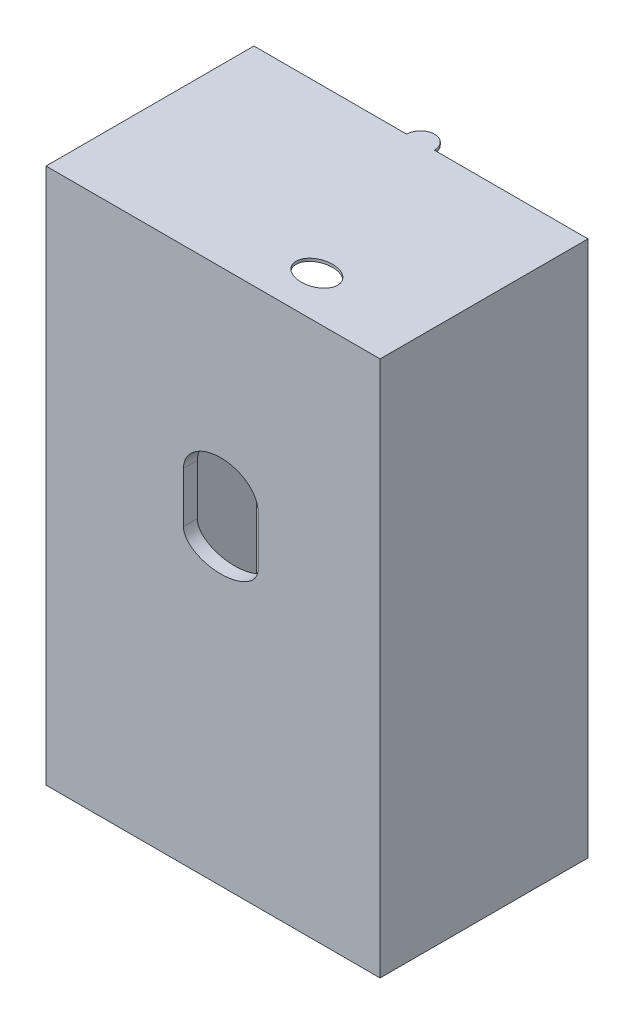
ISO-10303-21;
HEADER;
FILE_DESCRIPTION(('STEP AP214'),'2;1');
FILE_NAME('part.step','',(''),(''),'','','');
FILE_SCHEMA(('AUTOMOTIVE_DESIGN { 1 0 10303 214 1 1 1 1 }'));
ENDSEC;
DATA;
#1=APPLICATION_CONTEXT('core data for automotive mechanical design processes');
#2=APPLICATION_PROTOCOL_DEFINITION('international standard','automotive_design',2000,#1);
#3=PRODUCT_CONTEXT('',#1,'mechanical');
#4=PRODUCT('Part','Part','',(#3));
#5=PRODUCT_RELATED_PRODUCT_CATEGORY('part','',(#4));
#6=PRODUCT_DEFINITION_FORMATION('','',#4);
#7=PRODUCT_DEFINITION_CONTEXT('part definition',#1,'design');
#8=PRODUCT_DEFINITION('design','',#6,#7);
#9=PRODUCT_DEFINITION_SHAPE('','',#8);
#10=(LENGTH_UNIT() NAMED_UNIT(*) SI_UNIT(.MILLI.,.METRE.));
#11=(NAMED_UNIT(*) PLANE_ANGLE_UNIT() SI_UNIT($,.RADIAN.));
#12=(NAMED_UNIT(*) SI_UNIT($,.STERADIAN.) SOLID_ANGLE_UNIT());
#13=UNCERTAINTY_MEASURE_WITH_UNIT(LENGTH_MEASURE(1.E-05),#10,'distance_accuracy_value','');
#14=(GEOMETRIC_REPRESENTATION_CONTEXT(3) GLOBAL_UNCERTAINTY_ASSIGNED_CONTEXT((#13)) GLOBAL_UNIT_ASSIGNED_CONTEXT((#10,
#11,#12)) REPRESENTATION_CONTEXT('',''));
#15=CARTESIAN_POINT('',(0.,0.,0.));
#16=DIRECTION('',(0.,0.,1.));
#17=DIRECTION('',(1.,0.,0.));
#18=AXIS2_PLACEMENT_3D('',#15,#16,#17);
#19=CARTESIAN_POINT('',(-60.2322063663357,96.6546289170818,75.));
#20=DIRECTION('',(1.,0.,0.));
#21=DIRECTION('',(0.,1.,0.));
#22=AXIS2_PLACEMENT_3D('',#19,#20,#21);
#23=PLANE('',#22);
#24=DIRECTION('',(0.,-1.,0.));
#25=VECTOR('',#24,1.);
#26=CARTESIAN_POINT('',(-60.2322063663357,96.6546289170818,0.));
#27=LINE('',#26,#25);
#28=CARTESIAN_POINT('',(-60.2322063663357,96.6546289170818,0.));
#29=VERTEX_POINT('',#28);
#30=CARTESIAN_POINT('',(-60.2322063663357,-96.7686722464937,0.));
#31=VERTEX_POINT('',#30);
#32=EDGE_CURVE('E224',#29,#31,#27,.T.);
#33=ORIENTED_EDGE('',*,*,#32,.T.);
#34=DIRECTION('',(0.,0.,-1.));
#35=VECTOR('',#34,1.);
#36=CARTESIAN_POINT('',(-60.2322063663357,-96.7686722464937,75.));
#37=LINE('',#36,#35);
#38=CARTESIAN_POINT('',(-60.2322063663357,-96.7686722464937,75.));
#39=VERTEX_POINT('',#38);
#40=EDGE_CURVE('E220',#39,#31,#37,.T.);
#41=ORIENTED_EDGE('',*,*,#40,.F.);
#42=DIRECTION('',(0.,-1.,0.));
#43=VECTOR('',#42,1.);
#44=CARTESIAN_POINT('',(-60.2322063663357,96.6546289170818,75.));
#45=LINE('',#44,#43);
#46=CARTESIAN_POINT('',(-60.2322063663357,96.6546289170818,75.));
#47=VERTEX_POINT('',#46);
#48=EDGE_CURVE('E238',#47,#39,#45,.T.);
#49=ORIENTED_EDGE('',*,*,#48,.F.);
#50=DIRECTION('',(0.,0.,-1.));
#51=VECTOR('',#50,1.);
#52=CARTESIAN_POINT('',(-60.2322063663357,96.6546289170818,75.));
#53=LINE('',#52,#51);
#54=EDGE_CURVE('E239',#47,#29,#53,.T.);
#55=ORIENTED_EDGE('',*,*,#54,.T.);
#56=EDGE_LOOP('',(#33,#41,#49,#55));
#57=FACE_BOUND('',#56,.T.);
#58=ADVANCED_FACE('F33',(#57),#23,.F.);
#59=CARTESIAN_POINT('',(-60.2322063663357,-96.7686722464937,75.));
#60=DIRECTION('',(0.,1.,0.));
#61=DIRECTION('',(-1.,0.,0.));
#62=AXIS2_PLACEMENT_3D('',#59,#60,#61);
#63=PLANE('',#62);
#64=DIRECTION('',(1.,0.,0.));
#65=VECTOR('',#64,1.);
#66=CARTESIAN_POINT('',(-60.2322063663357,-96.7686722464937,0.));
#67=LINE('',#66,#65);
#68=CARTESIAN_POINT('',(60.2848054498777,-96.7686722464937,0.));
#69=VERTEX_POINT('',#68);
#70=EDGE_CURVE('E215',#31,#69,#67,.T.);
#71=ORIENTED_EDGE('',*,*,#70,.T.);
#72=DIRECTION('',(0.,0.,-1.));
#73=VECTOR('',#72,1.);
#74=CARTESIAN_POINT('',(60.2848054498777,-96.7686722464937,75.));
#75=LINE('',#74,#73);
#76=CARTESIAN_POINT('',(60.2848054498777,-96.7686722464937,75.));
#77=VERTEX_POINT('',#76);
#78=EDGE_CURVE('E217',#77,#69,#75,.T.);
#79=ORIENTED_EDGE('',*,*,#78,.F.);
#80=DIRECTION('',(1.,0.,0.));
#81=VECTOR('',#80,1.);
#82=CARTESIAN_POINT('',(-60.2322063663357,-96.7686722464937,75.));
#83=LINE('',#82,#81);
#84=EDGE_CURVE('E305',#39,#77,#83,.T.);
#85=ORIENTED_EDGE('',*,*,#84,.F.);
#86=ORIENTED_EDGE('',*,*,#40,.T.);
#87=EDGE_LOOP('',(#71,#79,#85,#86));
#88=FACE_BOUND('',#87,.T.);
#89=ADVANCED_FACE('F204',(#88),#63,.F.);
#90=CARTESIAN_POINT('',(60.2848054498777,96.6546289170818,75.));
#91=DIRECTION('',(1.,0.,0.));
#92=DIRECTION('',(0.,1.,0.));
#93=AXIS2_PLACEMENT_3D('',#90,#91,#92);
#94=PLANE('',#93);
#95=DIRECTION('',(0.,-1.,0.));
#96=VECTOR('',#95,1.);
#97=CARTESIAN_POINT('',(60.2848054498777,96.6546289170818,0.));
#98=LINE('',#97,#96);
#99=CARTESIAN_POINT('',(60.2848054498777,96.6546289170818,0.));
#100=VERTEX_POINT('',#99);
#101=EDGE_CURVE('E223',#100,#69,#98,.T.);
#102=ORIENTED_EDGE('',*,*,#101,.F.);
#103=DIRECTION('',(0.,0.,-1.));
#104=VECTOR('',#103,1.);
#105=CARTESIAN_POINT('',(60.2848054498777,96.6546289170818,75.));
#106=LINE('',#105,#104);
#107=CARTESIAN_POINT('',(60.2848054498777,96.6546289170818,75.));
#108=VERTEX_POINT('',#107);
#109=EDGE_CURVE('E241',#108,#100,#106,.T.);
#110=ORIENTED_EDGE('',*,*,#109,.F.);
#111=DIRECTION('',(0.,-1.,0.));
#112=VECTOR('',#111,1.);
#113=CARTESIAN_POINT('',(60.2848054498777,96.6546289170818,75.));
#114=LINE('',#113,#112);
#115=EDGE_CURVE('E307',#108,#77,#114,.T.);
#116=ORIENTED_EDGE('',*,*,#115,.T.);
#117=ORIENTED_EDGE('',*,*,#78,.T.);
#118=EDGE_LOOP('',(#102,#110,#116,#117));
#119=FACE_BOUND('',#118,.T.);
#120=ADVANCED_FACE('F201',(#119),#94,.T.);
#121=CARTESIAN_POINT('',(-60.2322063663357,96.6546289170818,75.));
#122=DIRECTION('',(0.,1.,0.));
#123=DIRECTION('',(0.,0.,1.));
#124=AXIS2_PLACEMENT_3D('',#121,#122,#123);
#125=PLANE('',#124);
#126=CARTESIAN_POINT('',(14.6071267442289,96.6546289170818,59.6252740657168));
#127=CARTESIAN_POINT('',(14.6071267442289,96.6546289170818,59.9964232358016));
#128=CARTESIAN_POINT('',(14.6557536156832,96.6546289170818,60.3606546169757));
#129=CARTESIAN_POINT('',(14.797863596421,96.6546289170818,60.8971614258045));
#130=CARTESIAN_POINT('',(14.8568495959941,96.6546289170818,61.0743445046378));
#131=CARTESIAN_POINT('',(14.9984446000285,96.6546289170818,61.4253499903886));
#132=CARTESIAN_POINT('',(15.0814846221753,96.6546289170818,61.599936569755));
#133=CARTESIAN_POINT('',(15.3646727900112,96.6546289170818,62.1130677915949));
#134=CARTESIAN_POINT('',(15.5953408905181,96.6546289170818,62.4361796315241));
#135=CARTESIAN_POINT('',(16.0021799884325,96.6546289170818,62.8932798013749));
#136=CARTESIAN_POINT('',(16.1480062684244,96.6546289170818,63.0410185045289));
#137=CARTESIAN_POINT('',(16.460654261866,96.6546289170818,63.3269820622723));
#138=CARTESIAN_POINT('',(16.6272324069616,96.6546289170818,63.4647941320253));
#139=CARTESIAN_POINT('',(17.147507806283,96.6546289170818,63.8549233786363));
#140=CARTESIAN_POINT('',(17.5248507547321,96.6546289170818,64.0873003864947));
#141=CARTESIAN_POINT('',(18.1366361103774,96.6546289170818,64.3942731667104));
#142=CARTESIAN_POINT('',(18.3494765272187,96.6546289170818,64.4900805892724));
#143=CARTESIAN_POINT('',(18.7843830000404,96.6546289170818,64.6644837047897));
#144=CARTESIAN_POINT('',(19.0060616624767,96.6546289170818,64.743067855173));
#145=CARTESIAN_POINT('',(19.683439185883,96.6546289170818,64.9536507628154));
#146=CARTESIAN_POINT('',(20.1513603898962,96.6546289170818,65.0607230609557));
#147=CARTESIAN_POINT('',(21.1209844753197,96.6546289170818,65.2059727164201));
#148=CARTESIAN_POINT('',(21.6109514652554,96.6546289170818,65.242067863049));
#149=CARTESIAN_POINT('',(22.3438013414117,96.6546289170818,65.2426246900536));
#150=CARTESIAN_POINT('',(22.5882582415265,96.6546289170818,65.233893569551));
#151=CARTESIAN_POINT('',(23.0775257100424,96.6546289170818,65.1982664783932));
#152=CARTESIAN_POINT('',(23.3236022225646,96.6546289170818,65.1711293851295));
#153=CARTESIAN_POINT('',(24.0482535900313,96.6546289170818,65.0635683628188));
#154=CARTESIAN_POINT('',(24.5159899920266,96.6546289170818,64.9574580099601));
#155=CARTESIAN_POINT('',(25.4212588296085,96.6546289170818,64.6776069521801));
#156=CARTESIAN_POINT('',(25.8620823993143,96.6546289170818,64.5015565664001));
#157=CARTESIAN_POINT('',(26.6769465514103,96.6546289170818,64.0943899076633));
#158=CARTESIAN_POINT('',(27.0551634477781,96.6546289170818,63.8626225216025));
#159=CARTESIAN_POINT('',(27.5779871549832,96.6546289170818,63.4720404496641));
#160=CARTESIAN_POINT('',(27.7452260911111,96.6546289170818,63.334101772021));
#161=CARTESIAN_POINT('',(28.0574580034179,96.6546289170818,63.049567490326));
#162=CARTESIAN_POINT('',(28.2033738697258,96.6546289170818,62.902368402998));
#163=CARTESIAN_POINT('',(28.6111074886535,96.6546289170818,62.4462587842356));
#164=CARTESIAN_POINT('',(28.8438537346718,96.6546289170818,62.1218030739528));
#165=CARTESIAN_POINT('',(29.2232939722261,96.6546289170818,61.4375076783281));
#166=CARTESIAN_POINT('',(29.3653031751467,96.6546289170818,61.0867705083213));
#167=CARTESIAN_POINT('',(29.5092304499386,96.6546289170818,60.5482269953212));
#168=CARTESIAN_POINT('',(29.5456074262122,96.6546289170818,60.366624343787));
#169=CARTESIAN_POINT('',(29.594557112799,96.6546289170818,59.9991335207929));
#170=CARTESIAN_POINT('',(29.6069453232544,96.6546289170818,59.813278673574));
#171=CARTESIAN_POINT('',(29.6074835794741,96.6546289170818,59.2615783207284));
#172=CARTESIAN_POINT('',(29.5600665968676,96.6546289170818,58.8974213152505));
#173=CARTESIAN_POINT('',(29.4174602438068,96.6546289170818,58.3566367080375));
#174=CARTESIAN_POINT('',(29.3575358032645,96.6546289170818,58.1763771778837));
#175=CARTESIAN_POINT('',(29.2146313970312,96.6546289170818,57.8224337859352));
#176=CARTESIAN_POINT('',(29.1320570144049,96.6546289170818,57.6493718709743));
#177=CARTESIAN_POINT('',(28.8519022369973,96.6546289170818,57.1415868204655));
#178=CARTESIAN_POINT('',(28.6222012699506,96.6546289170818,56.818155033297));
#179=CARTESIAN_POINT('',(28.2112848728313,96.6546289170818,56.3563366296651));
#180=CARTESIAN_POINT('',(28.0638083324809,96.6546289170818,56.2072046642251));
#181=CARTESIAN_POINT('',(27.7529333852407,96.6546289170818,55.9230519143989));
#182=CARTESIAN_POINT('',(27.4248623252978,96.6546289170818,55.6515436643841));
#183=CARTESIAN_POINT('',(27.0628112935085,96.6546289170818,55.4050212792002));
#184=CARTESIAN_POINT('',(26.6834827777755,96.6546289170818,55.1712032270388));
#185=CARTESIAN_POINT('',(26.4839995330221,96.6546289170818,55.0601010626511));
#186=CARTESIAN_POINT('',(25.8696608168199,96.6546289170818,54.7520958394499));
#187=CARTESIAN_POINT('',(25.4386731696236,96.6546289170818,54.5793794151728));
#188=CARTESIAN_POINT('',(24.5347103571551,96.6546289170818,54.297863736232));
#189=CARTESIAN_POINT('',(24.0568626027965,96.6546289170818,54.1888348214964));
#190=CARTESIAN_POINT('',(23.0958787345858,96.6546289170818,54.045053541942));
#191=CARTESIAN_POINT('',(22.6096834945479,96.6546289170818,54.0086319629234));
#192=CARTESIAN_POINT('',(21.8717314037882,96.6546289170818,54.0078516555593));
#193=CARTESIAN_POINT('',(21.6232177832185,96.6546289170818,54.0167824822843));
#194=CARTESIAN_POINT('',(21.1334745190014,96.6546289170818,54.0525937939761));
#195=CARTESIAN_POINT('',(20.8912281008622,96.6546289170818,54.0793956048388));
#196=CARTESIAN_POINT('',(20.1722009554702,96.6546289170818,54.185935332842));
#197=CARTESIAN_POINT('',(19.7022485555233,96.6546289170818,54.2917999129508));
#198=CARTESIAN_POINT('',(18.7869929645852,96.6546289170818,54.574854930576));
#199=CARTESIAN_POINT('',(18.3552864337325,96.6546289170818,54.7477028419286));
#200=CARTESIAN_POINT('',(17.7451378821999,96.6546289170818,55.0521783385769));
#201=CARTESIAN_POINT('',(17.5480362653717,96.6546289170818,55.161259722086));
#202=CARTESIAN_POINT('',(17.166702804097,96.6546289170818,55.3949729052418));
#203=CARTESIAN_POINT('',(16.9823015919366,96.6546289170818,55.5198947295284));
#204=CARTESIAN_POINT('',(16.4606732306887,96.6546289170818,55.9098944824587));
#205=CARTESIAN_POINT('',(16.1503713939002,96.6546289170818,56.1925086360564));
#206=CARTESIAN_POINT('',(15.6042348073922,96.6546289170818,56.8027036786891));
#207=CARTESIAN_POINT('',(15.3684520418876,96.6546289170818,57.1323003067452));
#208=CARTESIAN_POINT('',(14.9931641833229,96.6546289170818,57.8090218313439));
#209=CARTESIAN_POINT('',(14.8502497492414,96.6546289170818,58.1592771386497));
#210=CARTESIAN_POINT('',(14.6563126573517,96.6546289170818,58.8842237739162));
#211=CARTESIAN_POINT('',(14.6071267442289,96.6546289170818,59.2541248956319));
#212=CARTESIAN_POINT('',(14.6071267442289,96.6546289170818,59.6252740657168));
#213=B_SPLINE_CURVE_WITH_KNOTS('',3,(#126,#127,#128,#129,#130,#131,#132,#133,#134,#135,#136,
#137,#138,#139,#140,#141,#142,#143,#144,#145,#146,#147,#148,#149,#150,#151,#152,#153,#154,#155,
#156,#157,#158,#159,#160,#161,#162,#163,#164,#165,#166,#167,#168,#169,#170,#171,#172,#173,#174,
#175,#176,#177,#178,#179,#180,#181,#182,#183,#184,#185,#186,#187,#188,#189,#190,#191,#192,#193,
#194,#195,#196,#197,#198,#199,#200,#201,#202,#203,#204,#205,#206,#207,#208,#209,#210,#211,#212),
.UNSPECIFIED.,.T.,.F.,(4,2,2,2,2,2,2,2,2,2,2,2,2,2,2,2,2,2,2,2,2,2,2,2,2,2,2,2,1,2,2,2,2,2,2,2,
2,2,2,2,2,2,2,4),(0.,0.0312500000000005,0.0468750000000007,0.0625000000000009,
0.0937500000000012,0.109375000000001,0.125000000000002,0.156250000000002,0.171875000000002,
0.187500000000002,0.218750000000002,0.250000000000002,0.265625000000002,0.281250000000002,
0.312500000000002,0.343750000000002,0.375000000000002,0.390625000000002,0.406250000000002,
0.437500000000002,0.468750000000002,0.484375000000002,0.500000000000002,0.531250000000002,
0.546875000000001,0.562500000000001,0.593750000000001,0.609375000000001,0.625000000000001,
0.640625000000001,0.656250000000001,0.687500000000001,0.718750000000001,0.750000000000001,
0.765625000000001,0.781250000000001,0.8125,0.84375,0.859375,0.875,0.90625,0.9375,0.96875,1.),.UNSPECIFIED.);
#214=CARTESIAN_POINT('',(14.6071267442289,96.6546289170818,59.6252740657168));
#215=VERTEX_POINT('',#214);
#216=EDGE_CURVE('E153',#215,#215,#213,.T.);
#217=ORIENTED_EDGE('',*,*,#216,.F.);
#218=EDGE_LOOP('',(#217));
#219=FACE_BOUND('',#218,.T.);
#220=DIRECTION('',(1.,0.,0.));
#221=VECTOR('',#220,1.);
#222=CARTESIAN_POINT('',(-60.2322063663357,96.6546289170818,0.));
#223=LINE('',#222,#221);
#224=CARTESIAN_POINT('',(-5.12069253922095,96.6546289170818,0.));
#225=VERTEX_POINT('',#224);
#226=EDGE_CURVE('E233',#29,#225,#223,.T.);
#227=ORIENTED_EDGE('',*,*,#226,.F.);
#228=ORIENTED_EDGE('',*,*,#54,.F.);
#229=DIRECTION('',(1.,0.,0.));
#230=VECTOR('',#229,1.);
#231=CARTESIAN_POINT('',(-60.2322063663357,96.6546289170818,75.));
#232=LINE('',#231,#230);
#233=EDGE_CURVE('E242',#47,#108,#232,.T.);
#234=ORIENTED_EDGE('',*,*,#233,.T.);
#235=ORIENTED_EDGE('',*,*,#109,.T.);
#236=CARTESIAN_POINT('',(4.87878688502191,96.6546289170818,0.));
#237=VERTEX_POINT('',#236);
#238=EDGE_CURVE('E230',#237,#100,#223,.T.);
#239=ORIENTED_EDGE('',*,*,#238,.F.);
#240=CARTESIAN_POINT('',(-0.120952827099521,96.6546289170818,-0.0510177521645051));
#241=DIRECTION('',(0.,1.,0.));
#242=DIRECTION('',(0.,0.,1.));
#243=AXIS2_PLACEMENT_3D('',#240,#241,#242);
#244=CIRCLE('',#243,5.);
#245=EDGE_CURVE('E257',#237,#225,#244,.T.);
#246=ORIENTED_EDGE('',*,*,#245,.T.);
#247=EDGE_LOOP('',(#227,#228,#234,#235,#239,#246));
#248=FACE_BOUND('',#247,.T.);
#249=ADVANCED_FACE('F195',(#219,#248),#125,.T.);
#250=CARTESIAN_POINT('',(0.,0.,75.));
#251=DIRECTION('',(0.,0.,1.));
#252=DIRECTION('',(1.,0.,0.));
#253=AXIS2_PLACEMENT_3D('',#250,#251,#252);
#254=PLANE('',#253);
#255=CARTESIAN_POINT('',(2.7910522765272,26.9663496144694,75.));
#256=DIRECTION('',(0.,0.,-1.));
#257=DIRECTION('',(-1.,0.,0.));
#258=AXIS2_PLACEMENT_3D('',#255,#256,#257);
#259=ELLIPSE('',#258,13.4456532314962,10.0763446319792);
#260=CARTESIAN_POINT('',(-10.654600954969,26.9663496144694,75.));
#261=VERTEX_POINT('',#260);
#262=CARTESIAN_POINT('',(16.2367055080234,26.9663496144694,75.));
#263=VERTEX_POINT('',#262);
#264=EDGE_CURVE('E139',#261,#263,#259,.T.);
#265=ORIENTED_EDGE('',*,*,#264,.T.);
#266=DIRECTION('',(0.,-1.,0.));
#267=VECTOR('',#266,1.);
#268=CARTESIAN_POINT('',(16.2367055080234,8.80384784274683,75.));
#269=LINE('',#268,#267);
#270=CARTESIAN_POINT('',(16.2367055080234,8.80384784274683,75.));
#271=VERTEX_POINT('',#270);
#272=EDGE_CURVE('E146',#263,#271,#269,.T.);
#273=ORIENTED_EDGE('',*,*,#272,.T.);
#274=CARTESIAN_POINT('',(2.79105227652721,8.80384784274684,75.));
#275=DIRECTION('',(0.,0.,-1.));
#276=DIRECTION('',(1.,0.,0.));
#277=AXIS2_PLACEMENT_3D('',#274,#275,#276);
#278=ELLIPSE('',#277,13.4456532314962,8.07699712461387);
#279=CARTESIAN_POINT('',(-10.654600954969,8.80384784274684,75.));
#280=VERTEX_POINT('',#279);
#281=EDGE_CURVE('E50',#271,#280,#278,.T.);
#282=ORIENTED_EDGE('',*,*,#281,.T.);
#283=DIRECTION('',(0.,1.,0.));
#284=VECTOR('',#283,1.);
#285=CARTESIAN_POINT('',(-10.654600954969,8.80384784274684,75.));
#286=LINE('',#285,#284);
#287=EDGE_CURVE('E143',#280,#261,#286,.T.);
#288=ORIENTED_EDGE('',*,*,#287,.T.);
#289=EDGE_LOOP('',(#265,#273,#282,#288));
#290=FACE_BOUND('',#289,.T.);
#291=ORIENTED_EDGE('',*,*,#48,.T.);
#292=ORIENTED_EDGE('',*,*,#84,.T.);
#293=ORIENTED_EDGE('',*,*,#115,.F.);
#294=ORIENTED_EDGE('',*,*,#233,.F.);
#295=EDGE_LOOP('',(#291,#292,#293,#294));
#296=FACE_BOUND('',#295,.T.);
#297=ADVANCED_FACE('F150',(#290,#296),#254,.T.);
#298=CARTESIAN_POINT('',(0.,0.,0.));
#299=DIRECTION('',(0.,0.,1.));
#300=DIRECTION('',(1.,0.,0.));
#301=AXIS2_PLACEMENT_3D('',#298,#299,#300);
#302=PLANE('',#301);
#303=DIRECTION('',(1.,0.,0.));
#304=VECTOR('',#303,1.);
#305=CARTESIAN_POINT('',(0.,95.6546289170818,0.));
#306=LINE('',#305,#304);
#307=CARTESIAN_POINT('',(4.87878688502191,95.6546289170818,0.));
#308=VERTEX_POINT('',#307);
#309=CARTESIAN_POINT('',(59.2848054498777,95.6546289170818,0.));
#310=VERTEX_POINT('',#309);
#311=EDGE_CURVE('E270',#308,#310,#306,.T.);
#312=ORIENTED_EDGE('',*,*,#311,.F.);
#313=DIRECTION('',(0.,1.,0.));
#314=VECTOR('',#313,1.);
#315=CARTESIAN_POINT('',(4.87878688502191,95.6546289170818,0.));
#316=LINE('',#315,#314);
#317=EDGE_CURVE('E266',#308,#237,#316,.T.);
#318=ORIENTED_EDGE('',*,*,#317,.T.);
#319=ORIENTED_EDGE('',*,*,#238,.T.);
#320=ORIENTED_EDGE('',*,*,#101,.T.);
#321=ORIENTED_EDGE('',*,*,#70,.F.);
#322=ORIENTED_EDGE('',*,*,#32,.F.);
#323=ORIENTED_EDGE('',*,*,#226,.T.);
#324=DIRECTION('',(0.,1.,0.));
#325=VECTOR('',#324,1.);
#326=CARTESIAN_POINT('',(-5.12069253922095,95.6546289170818,0.));
#327=LINE('',#326,#325);
#328=CARTESIAN_POINT('',(-5.12069253922095,95.6546289170818,0.));
#329=VERTEX_POINT('',#328);
#330=EDGE_CURVE('E268',#329,#225,#327,.T.);
#331=ORIENTED_EDGE('',*,*,#330,.F.);
#332=CARTESIAN_POINT('',(-59.2322063663357,95.6546289170818,0.));
#333=VERTEX_POINT('',#332);
#334=EDGE_CURVE('E284',#333,#329,#306,.T.);
#335=ORIENTED_EDGE('',*,*,#334,.F.);
#336=DIRECTION('',(0.,-1.,0.));
#337=VECTOR('',#336,1.);
#338=CARTESIAN_POINT('',(-59.2322063663357,0.,0.));
#339=LINE('',#338,#337);
#340=CARTESIAN_POINT('',(-59.2322063663357,-95.7686722464937,0.));
#341=VERTEX_POINT('',#340);
#342=EDGE_CURVE('E287',#333,#341,#339,.T.);
#343=ORIENTED_EDGE('',*,*,#342,.T.);
#344=DIRECTION('',(1.,0.,0.));
#345=VECTOR('',#344,1.);
#346=CARTESIAN_POINT('',(0.,-95.7686722464937,0.));
#347=LINE('',#346,#345);
#348=CARTESIAN_POINT('',(59.2848054498777,-95.7686722464937,0.));
#349=VERTEX_POINT('',#348);
#350=EDGE_CURVE('E290',#341,#349,#347,.T.);
#351=ORIENTED_EDGE('',*,*,#350,.T.);
#352=DIRECTION('',(0.,-1.,0.));
#353=VECTOR('',#352,1.);
#354=CARTESIAN_POINT('',(59.2848054498777,0.,0.));
#355=LINE('',#354,#353);
#356=EDGE_CURVE('E276',#310,#349,#355,.T.);
#357=ORIENTED_EDGE('',*,*,#356,.F.);
#358=EDGE_LOOP('',(#312,#318,#319,#320,#321,#322,#323,#331,#335,#343,#351,#357));
#359=FACE_BOUND('',#358,.T.);
#360=ADVANCED_FACE('F191',(#359),#302,.F.);
#361=CARTESIAN_POINT('',(0.,95.6546289170818,70.));
#362=DIRECTION('',(0.,1.,0.));
#363=DIRECTION('',(0.,0.,1.));
#364=AXIS2_PLACEMENT_3D('',#361,#362,#363);
#365=PLANE('',#364);
#366=CARTESIAN_POINT('',(14.6071267442289,95.6546289170818,59.6252740657168));
#367=CARTESIAN_POINT('',(14.6071267442289,95.6546289170818,59.9964232358016));
#368=CARTESIAN_POINT('',(14.6557536156832,95.6546289170818,60.3606546169757));
#369=CARTESIAN_POINT('',(14.797863596421,95.6546289170818,60.8971614258045));
#370=CARTESIAN_POINT('',(14.8568495959941,95.6546289170818,61.0743445046378));
#371=CARTESIAN_POINT('',(14.9984446000285,95.6546289170818,61.4253499903886));
#372=CARTESIAN_POINT('',(15.0814846221753,95.6546289170818,61.599936569755));
#373=CARTESIAN_POINT('',(15.3646727900112,95.6546289170818,62.1130677915949));
#374=CARTESIAN_POINT('',(15.5953408905181,95.6546289170818,62.4361796315241));
#375=CARTESIAN_POINT('',(16.0021799884325,95.6546289170818,62.8932798013749));
#376=CARTESIAN_POINT('',(16.1480062684244,95.6546289170818,63.0410185045289));
#377=CARTESIAN_POINT('',(16.460654261866,95.6546289170818,63.3269820622723));
#378=CARTESIAN_POINT('',(16.6272324069616,95.6546289170818,63.4647941320253));
#379=CARTESIAN_POINT('',(17.147507806283,95.6546289170818,63.8549233786363));
#380=CARTESIAN_POINT('',(17.5248507547321,95.6546289170818,64.0873003864947));
#381=CARTESIAN_POINT('',(18.1366361103774,95.6546289170818,64.3942731667104));
#382=CARTESIAN_POINT('',(18.3494765272187,95.6546289170818,64.4900805892724));
#383=CARTESIAN_POINT('',(18.7843830000404,95.6546289170818,64.6644837047897));
#384=CARTESIAN_POINT('',(19.0060616624767,95.6546289170818,64.743067855173));
#385=CARTESIAN_POINT('',(19.683439185883,95.6546289170818,64.9536507628154));
#386=CARTESIAN_POINT('',(20.1513603898962,95.6546289170818,65.0607230609557));
#387=CARTESIAN_POINT('',(21.1209844753197,95.6546289170818,65.2059727164201));
#388=CARTESIAN_POINT('',(21.6109514652554,95.6546289170818,65.242067863049));
#389=CARTESIAN_POINT('',(22.3438013414117,95.6546289170818,65.2426246900536));
#390=CARTESIAN_POINT('',(22.5882582415265,95.6546289170818,65.233893569551));
#391=CARTESIAN_POINT('',(23.0775257100424,95.6546289170818,65.1982664783932));
#392=CARTESIAN_POINT('',(23.3236022225646,95.6546289170818,65.1711293851295));
#393=CARTESIAN_POINT('',(24.0482535900313,95.6546289170818,65.0635683628188));
#394=CARTESIAN_POINT('',(24.5159899920266,95.6546289170818,64.9574580099601));
#395=CARTESIAN_POINT('',(25.4212588296085,95.6546289170818,64.6776069521801));
#396=CARTESIAN_POINT('',(25.8620823993143,95.6546289170818,64.5015565664001));
#397=CARTESIAN_POINT('',(26.6769465514103,95.6546289170818,64.0943899076633));
#398=CARTESIAN_POINT('',(27.0551634477781,95.6546289170818,63.8626225216025));
#399=CARTESIAN_POINT('',(27.5779871549832,95.6546289170818,63.4720404496641));
#400=CARTESIAN_POINT('',(27.7452260911111,95.6546289170818,63.334101772021));
#401=CARTESIAN_POINT('',(28.0574580034179,95.6546289170818,63.049567490326));
#402=CARTESIAN_POINT('',(28.2033738697258,95.6546289170818,62.902368402998));
#403=CARTESIAN_POINT('',(28.6111074886535,95.6546289170818,62.4462587842356));
#404=CARTESIAN_POINT('',(28.8438537346718,95.6546289170818,62.1218030739528));
#405=CARTESIAN_POINT('',(29.2232939722261,95.6546289170818,61.4375076783281));
#406=CARTESIAN_POINT('',(29.3653031751467,95.6546289170818,61.0867705083213));
#407=CARTESIAN_POINT('',(29.5092304499386,95.6546289170818,60.5482269953212));
#408=CARTESIAN_POINT('',(29.5456074262122,95.6546289170818,60.366624343787));
#409=CARTESIAN_POINT('',(29.594557112799,95.6546289170818,59.9991335207929));
#410=CARTESIAN_POINT('',(29.6069453232544,95.6546289170818,59.813278673574));
#411=CARTESIAN_POINT('',(29.6074835794741,95.6546289170818,59.2615783207284));
#412=CARTESIAN_POINT('',(29.5600665968676,95.6546289170818,58.8974213152505));
#413=CARTESIAN_POINT('',(29.4174602438068,95.6546289170818,58.3566367080375));
#414=CARTESIAN_POINT('',(29.3575358032645,95.6546289170818,58.1763771778837));
#415=CARTESIAN_POINT('',(29.2146313970312,95.6546289170818,57.8224337859352));
#416=CARTESIAN_POINT('',(29.1320570144049,95.6546289170818,57.6493718709743));
#417=CARTESIAN_POINT('',(28.8519022369973,95.6546289170818,57.1415868204655));
#418=CARTESIAN_POINT('',(28.6222012699506,95.6546289170818,56.818155033297));
#419=CARTESIAN_POINT('',(28.2112848728313,95.6546289170818,56.3563366296651));
#420=CARTESIAN_POINT('',(28.0638083324809,95.6546289170818,56.2072046642251));
#421=CARTESIAN_POINT('',(27.7529333852407,95.6546289170818,55.9230519143989));
#422=CARTESIAN_POINT('',(27.4248623252978,95.6546289170818,55.6515436643841));
#423=CARTESIAN_POINT('',(27.0628112935085,95.6546289170818,55.4050212792002));
#424=CARTESIAN_POINT('',(26.6834827777755,95.6546289170818,55.1712032270388));
#425=CARTESIAN_POINT('',(26.4839995330221,95.6546289170818,55.0601010626511));
#426=CARTESIAN_POINT('',(25.8696608168199,95.6546289170818,54.7520958394499));
#427=CARTESIAN_POINT('',(25.4386731696236,95.6546289170818,54.5793794151728));
#428=CARTESIAN_POINT('',(24.5347103571551,95.6546289170818,54.297863736232));
#429=CARTESIAN_POINT('',(24.0568626027965,95.6546289170818,54.1888348214964));
#430=CARTESIAN_POINT('',(23.0958787345858,95.6546289170818,54.045053541942));
#431=CARTESIAN_POINT('',(22.6096834945479,95.6546289170818,54.0086319629234));
#432=CARTESIAN_POINT('',(21.8717314037882,95.6546289170818,54.0078516555593));
#433=CARTESIAN_POINT('',(21.6232177832185,95.6546289170818,54.0167824822843));
#434=CARTESIAN_POINT('',(21.1334745190014,95.6546289170818,54.0525937939761));
#435=CARTESIAN_POINT('',(20.8912281008622,95.6546289170818,54.0793956048388));
#436=CARTESIAN_POINT('',(20.1722009554702,95.6546289170818,54.185935332842));
#437=CARTESIAN_POINT('',(19.7022485555233,95.6546289170818,54.2917999129508));
#438=CARTESIAN_POINT('',(18.7869929645852,95.6546289170818,54.574854930576));
#439=CARTESIAN_POINT('',(18.3552864337325,95.6546289170818,54.7477028419286));
#440=CARTESIAN_POINT('',(17.7451378821999,95.6546289170818,55.0521783385769));
#441=CARTESIAN_POINT('',(17.5480362653717,95.6546289170818,55.161259722086));
#442=CARTESIAN_POINT('',(17.166702804097,95.6546289170818,55.3949729052418));
#443=CARTESIAN_POINT('',(16.9823015919366,95.6546289170818,55.5198947295284));
#444=CARTESIAN_POINT('',(16.4606732306887,95.6546289170818,55.9098944824587));
#445=CARTESIAN_POINT('',(16.1503713939002,95.6546289170818,56.1925086360564));
#446=CARTESIAN_POINT('',(15.6042348073922,95.6546289170818,56.8027036786891));
#447=CARTESIAN_POINT('',(15.3684520418876,95.6546289170818,57.1323003067452));
#448=CARTESIAN_POINT('',(14.9931641833229,95.6546289170818,57.8090218313439));
#449=CARTESIAN_POINT('',(14.8502497492414,95.6546289170818,58.1592771386497));
#450=CARTESIAN_POINT('',(14.6563126573517,95.6546289170818,58.8842237739162));
#451=CARTESIAN_POINT('',(14.6071267442289,95.6546289170818,59.2541248956319));
#452=CARTESIAN_POINT('',(14.6071267442289,95.6546289170818,59.6252740657168));
#453=B_SPLINE_CURVE_WITH_KNOTS('',3,(#366,#367,#368,#369,#370,#371,#372,#373,#374,#375,#376,
#377,#378,#379,#380,#381,#382,#383,#384,#385,#386,#387,#388,#389,#390,#391,#392,#393,#394,#395,
#396,#397,#398,#399,#400,#401,#402,#403,#404,#405,#406,#407,#408,#409,#410,#411,#412,#413,#414,
#415,#416,#417,#418,#419,#420,#421,#422,#423,#424,#425,#426,#427,#428,#429,#430,#431,#432,#433,
#434,#435,#436,#437,#438,#439,#440,#441,#442,#443,#444,#445,#446,#447,#448,#449,#450,#451,#452),
.UNSPECIFIED.,.T.,.F.,(4,2,2,2,2,2,2,2,2,2,2,2,2,2,2,2,2,2,2,2,2,2,2,2,2,2,2,2,1,2,2,2,2,2,2,2,
2,2,2,2,2,2,2,4),(0.,0.0312500000000005,0.0468750000000007,0.0625000000000009,
0.0937500000000012,0.109375000000001,0.125000000000002,0.156250000000002,0.171875000000002,
0.187500000000002,0.218750000000002,0.250000000000002,0.265625000000002,0.281250000000002,
0.312500000000002,0.343750000000002,0.375000000000002,0.390625000000002,0.406250000000002,
0.437500000000002,0.468750000000002,0.484375000000002,0.500000000000002,0.531250000000002,
0.546875000000001,0.562500000000001,0.593750000000001,0.609375000000001,0.625000000000001,
0.640625000000001,0.656250000000001,0.687500000000001,0.718750000000001,0.750000000000001,
0.765625000000001,0.781250000000001,0.8125,0.84375,0.859375,0.875,0.90625,0.9375,0.96875,1.),.UNSPECIFIED.);
#454=CARTESIAN_POINT('',(14.6071267442289,95.6546289170818,59.6252740657168));
#455=VERTEX_POINT('',#454);
#456=EDGE_CURVE('E36',#455,#455,#453,.T.);
#457=ORIENTED_EDGE('',*,*,#456,.T.);
#458=EDGE_LOOP('',(#457));
#459=FACE_BOUND('',#458,.T.);
#460=ORIENTED_EDGE('',*,*,#334,.T.);
#461=CARTESIAN_POINT('',(-0.120952827099521,95.6546289170818,-0.0510177521645051));
#462=DIRECTION('',(0.,1.,0.));
#463=DIRECTION('',(0.,0.,1.));
#464=AXIS2_PLACEMENT_3D('',#461,#462,#463);
#465=CIRCLE('',#464,5.);
#466=EDGE_CURVE('E260',#308,#329,#465,.T.);
#467=ORIENTED_EDGE('',*,*,#466,.F.);
#468=ORIENTED_EDGE('',*,*,#311,.T.);
#469=DIRECTION('',(0.,0.,-1.));
#470=VECTOR('',#469,1.);
#471=CARTESIAN_POINT('',(59.2848054498777,95.6546289170818,70.));
#472=LINE('',#471,#470);
#473=CARTESIAN_POINT('',(59.2848054498777,95.6546289170818,70.));
#474=VERTEX_POINT('',#473);
#475=EDGE_CURVE('E283',#474,#310,#472,.T.);
#476=ORIENTED_EDGE('',*,*,#475,.F.);
#477=DIRECTION('',(1.,0.,0.));
#478=VECTOR('',#477,1.);
#479=CARTESIAN_POINT('',(0.,95.6546289170818,70.));
#480=LINE('',#479,#478);
#481=CARTESIAN_POINT('',(-59.2322063663357,95.6546289170818,70.));
#482=VERTEX_POINT('',#481);
#483=EDGE_CURVE('E272',#482,#474,#480,.T.);
#484=ORIENTED_EDGE('',*,*,#483,.F.);
#485=DIRECTION('',(0.,0.,-1.));
#486=VECTOR('',#485,1.);
#487=CARTESIAN_POINT('',(-59.2322063663357,95.6546289170818,70.));
#488=LINE('',#487,#486);
#489=EDGE_CURVE('E301',#482,#333,#488,.T.);
#490=ORIENTED_EDGE('',*,*,#489,.T.);
#491=EDGE_LOOP('',(#460,#467,#468,#476,#484,#490));
#492=FACE_BOUND('',#491,.T.);
#493=ADVANCED_FACE('F187',(#459,#492),#365,.F.);
#494=CARTESIAN_POINT('',(-59.2322063663357,0.,70.));
#495=DIRECTION('',(1.,0.,0.));
#496=DIRECTION('',(0.,0.,-1.));
#497=AXIS2_PLACEMENT_3D('',#494,#495,#496);
#498=PLANE('',#497);
#499=ORIENTED_EDGE('',*,*,#342,.F.);
#500=ORIENTED_EDGE('',*,*,#489,.F.);
#501=DIRECTION('',(0.,-1.,0.));
#502=VECTOR('',#501,1.);
#503=CARTESIAN_POINT('',(-59.2322063663357,0.,70.));
#504=LINE('',#503,#502);
#505=CARTESIAN_POINT('',(-59.2322063663357,-95.7686722464937,70.));
#506=VERTEX_POINT('',#505);
#507=EDGE_CURVE('E275',#482,#506,#504,.T.);
#508=ORIENTED_EDGE('',*,*,#507,.T.);
#509=DIRECTION('',(0.,0.,-1.));
#510=VECTOR('',#509,1.);
#511=CARTESIAN_POINT('',(-59.2322063663357,-95.7686722464937,70.));
#512=LINE('',#511,#510);
#513=EDGE_CURVE('E299',#506,#341,#512,.T.);
#514=ORIENTED_EDGE('',*,*,#513,.T.);
#515=EDGE_LOOP('',(#499,#500,#508,#514));
#516=FACE_BOUND('',#515,.T.);
#517=ADVANCED_FACE('F183',(#516),#498,.T.);
#518=CARTESIAN_POINT('',(0.,-95.7686722464937,70.));
#519=DIRECTION('',(0.,1.,0.));
#520=DIRECTION('',(-1.,0.,0.));
#521=AXIS2_PLACEMENT_3D('',#518,#519,#520);
#522=PLANE('',#521);
#523=ORIENTED_EDGE('',*,*,#350,.F.);
#524=ORIENTED_EDGE('',*,*,#513,.F.);
#525=DIRECTION('',(1.,0.,0.));
#526=VECTOR('',#525,1.);
#527=CARTESIAN_POINT('',(0.,-95.7686722464937,70.));
#528=LINE('',#527,#526);
#529=CARTESIAN_POINT('',(59.2848054498777,-95.7686722464937,70.));
#530=VERTEX_POINT('',#529);
#531=EDGE_CURVE('E278',#506,#530,#528,.T.);
#532=ORIENTED_EDGE('',*,*,#531,.T.);
#533=DIRECTION('',(0.,0.,-1.));
#534=VECTOR('',#533,1.);
#535=CARTESIAN_POINT('',(59.2848054498777,-95.7686722464937,70.));
#536=LINE('',#535,#534);
#537=EDGE_CURVE('E297',#530,#349,#536,.T.);
#538=ORIENTED_EDGE('',*,*,#537,.T.);
#539=EDGE_LOOP('',(#523,#524,#532,#538));
#540=FACE_BOUND('',#539,.T.);
#541=ADVANCED_FACE('F179',(#540),#522,.T.);
#542=CARTESIAN_POINT('',(59.2848054498777,0.,70.));
#543=DIRECTION('',(1.,0.,0.));
#544=DIRECTION('',(0.,0.,-1.));
#545=AXIS2_PLACEMENT_3D('',#542,#543,#544);
#546=PLANE('',#545);
#547=ORIENTED_EDGE('',*,*,#356,.T.);
#548=ORIENTED_EDGE('',*,*,#537,.F.);
#549=DIRECTION('',(0.,-1.,0.));
#550=VECTOR('',#549,1.);
#551=CARTESIAN_POINT('',(59.2848054498777,0.,70.));
#552=LINE('',#551,#550);
#553=EDGE_CURVE('E280',#474,#530,#552,.T.);
#554=ORIENTED_EDGE('',*,*,#553,.F.);
#555=ORIENTED_EDGE('',*,*,#475,.T.);
#556=EDGE_LOOP('',(#547,#548,#554,#555));
#557=FACE_BOUND('',#556,.T.);
#558=ADVANCED_FACE('F175',(#557),#546,.F.);
#559=CARTESIAN_POINT('',(0.,0.,70.));
#560=DIRECTION('',(0.,0.,1.));
#561=DIRECTION('',(1.,0.,0.));
#562=AXIS2_PLACEMENT_3D('',#559,#560,#561);
#563=PLANE('',#562);
#564=DIRECTION('',(0.,1.,0.));
#565=VECTOR('',#564,1.);
#566=CARTESIAN_POINT('',(16.2367055080234,0.,70.));
#567=LINE('',#566,#565);
#568=CARTESIAN_POINT('',(16.2367055080234,8.80384784274683,70.));
#569=VERTEX_POINT('',#568);
#570=CARTESIAN_POINT('',(16.2367055080234,26.9663496144694,70.));
#571=VERTEX_POINT('',#570);
#572=EDGE_CURVE('E246',#569,#571,#567,.T.);
#573=ORIENTED_EDGE('',*,*,#572,.T.);
#574=CARTESIAN_POINT('',(2.7910522765272,26.9663496144694,70.));
#575=DIRECTION('',(0.,0.,-1.));
#576=DIRECTION('',(-1.,0.,0.));
#577=AXIS2_PLACEMENT_3D('',#574,#575,#576);
#578=ELLIPSE('',#577,13.4456532314962,10.0763446319792);
#579=CARTESIAN_POINT('',(-10.654600954969,26.9663496144694,70.));
#580=VERTEX_POINT('',#579);
#581=EDGE_CURVE('E11',#571,#580,#578,.F.);
#582=ORIENTED_EDGE('',*,*,#581,.T.);
#583=DIRECTION('',(0.,-1.,0.));
#584=VECTOR('',#583,1.);
#585=CARTESIAN_POINT('',(-10.654600954969,0.,70.));
#586=LINE('',#585,#584);
#587=CARTESIAN_POINT('',(-10.654600954969,8.80384784274684,70.));
#588=VERTEX_POINT('',#587);
#589=EDGE_CURVE('E43',#580,#588,#586,.T.);
#590=ORIENTED_EDGE('',*,*,#589,.T.);
#591=CARTESIAN_POINT('',(2.79105227652721,8.80384784274684,70.));
#592=DIRECTION('',(0.,0.,-1.));
#593=DIRECTION('',(1.,0.,0.));
#594=AXIS2_PLACEMENT_3D('',#591,#592,#593);
#595=ELLIPSE('',#594,13.4456532314962,8.07699712461387);
#596=EDGE_CURVE('E248',#588,#569,#595,.F.);
#597=ORIENTED_EDGE('',*,*,#596,.T.);
#598=EDGE_LOOP('',(#573,#582,#590,#597));
#599=FACE_BOUND('',#598,.T.);
#600=ORIENTED_EDGE('',*,*,#483,.T.);
#601=ORIENTED_EDGE('',*,*,#553,.T.);
#602=ORIENTED_EDGE('',*,*,#531,.F.);
#603=ORIENTED_EDGE('',*,*,#507,.F.);
#604=EDGE_LOOP('',(#600,#601,#602,#603));
#605=FACE_BOUND('',#604,.T.);
#606=ADVANCED_FACE('F171',(#599,#605),#563,.F.);
#607=CARTESIAN_POINT('',(-0.120952827099521,95.6546289170818,-0.0510177521645051));
#608=DIRECTION('',(0.,1.,0.));
#609=DIRECTION('',(0.,0.,1.));
#610=AXIS2_PLACEMENT_3D('',#607,#608,#609);
#611=CYLINDRICAL_SURFACE('',#610,5.);
#612=ORIENTED_EDGE('',*,*,#245,.F.);
#613=ORIENTED_EDGE('',*,*,#317,.F.);
#614=ORIENTED_EDGE('',*,*,#466,.T.);
#615=ORIENTED_EDGE('',*,*,#330,.T.);
#616=EDGE_LOOP('',(#612,#613,#614,#615));
#617=FACE_BOUND('',#616,.T.);
#618=ADVANCED_FACE('F167',(#617),#611,.T.);
#619=DIRECTION('',(0.,0.,-1.));
#620=VECTOR('',#619,1.);
#621=SURFACE_OF_LINEAR_EXTRUSION('',#259,#620);
#622=DIRECTION('',(0.,0.,-1.));
#623=VECTOR('',#622,1.);
#624=CARTESIAN_POINT('',(16.2367055080234,26.9663496144694,75.));
#625=LINE('',#624,#623);
#626=EDGE_CURVE('E58',#263,#571,#625,.T.);
#627=ORIENTED_EDGE('',*,*,#626,.F.);
#628=ORIENTED_EDGE('',*,*,#264,.F.);
#629=DIRECTION('',(0.,0.,-1.));
#630=VECTOR('',#629,1.);
#631=CARTESIAN_POINT('',(-10.654600954969,26.9663496144694,75.));
#632=LINE('',#631,#630);
#633=EDGE_CURVE('E255',#261,#580,#632,.T.);
#634=ORIENTED_EDGE('',*,*,#633,.T.);
#635=ORIENTED_EDGE('',*,*,#581,.F.);
#636=EDGE_LOOP('',(#627,#628,#634,#635));
#637=FACE_BOUND('',#636,.T.);
#638=ADVANCED_FACE('F136',(#637),#621,.F.);
#639=CARTESIAN_POINT('',(-10.654600954969,8.80384784274684,75.));
#640=DIRECTION('',(-1.,0.,0.));
#641=DIRECTION('',(0.,-1.,0.));
#642=AXIS2_PLACEMENT_3D('',#639,#640,#641);
#643=PLANE('',#642);
#644=ORIENTED_EDGE('',*,*,#633,.F.);
#645=ORIENTED_EDGE('',*,*,#287,.F.);
#646=DIRECTION('',(0.,0.,-1.));
#647=VECTOR('',#646,1.);
#648=CARTESIAN_POINT('',(-10.654600954969,8.80384784274684,75.));
#649=LINE('',#648,#647);
#650=EDGE_CURVE('E256',#280,#588,#649,.T.);
#651=ORIENTED_EDGE('',*,*,#650,.T.);
#652=ORIENTED_EDGE('',*,*,#589,.F.);
#653=EDGE_LOOP('',(#644,#645,#651,#652));
#654=FACE_BOUND('',#653,.T.);
#655=ADVANCED_FACE('F166',(#654),#643,.F.);
#656=DIRECTION('',(0.,0.,-1.));
#657=VECTOR('',#656,1.);
#658=SURFACE_OF_LINEAR_EXTRUSION('',#278,#657);
#659=ORIENTED_EDGE('',*,*,#650,.F.);
#660=ORIENTED_EDGE('',*,*,#281,.F.);
#661=DIRECTION('',(0.,0.,-1.));
#662=VECTOR('',#661,1.);
#663=CARTESIAN_POINT('',(16.2367055080234,8.80384784274683,75.));
#664=LINE('',#663,#662);
#665=EDGE_CURVE('E142',#271,#569,#664,.T.);
#666=ORIENTED_EDGE('',*,*,#665,.T.);
#667=ORIENTED_EDGE('',*,*,#596,.F.);
#668=EDGE_LOOP('',(#659,#660,#666,#667));
#669=FACE_BOUND('',#668,.T.);
#670=ADVANCED_FACE('F328',(#669),#658,.F.);
#671=CARTESIAN_POINT('',(16.2367055080234,8.80384784274683,75.));
#672=DIRECTION('',(1.,0.,0.));
#673=DIRECTION('',(0.,1.,0.));
#674=AXIS2_PLACEMENT_3D('',#671,#672,#673);
#675=PLANE('',#674);
#676=ORIENTED_EDGE('',*,*,#665,.F.);
#677=ORIENTED_EDGE('',*,*,#272,.F.);
#678=ORIENTED_EDGE('',*,*,#626,.T.);
#679=ORIENTED_EDGE('',*,*,#572,.F.);
#680=EDGE_LOOP('',(#676,#677,#678,#679));
#681=FACE_BOUND('',#680,.T.);
#682=ADVANCED_FACE('F147',(#681),#675,.F.);
#683=CARTESIAN_POINT('',(14.6071267442289,86.6546289170818,59.6252740657168));
#684=CARTESIAN_POINT('',(14.6071267442289,86.6546289170818,59.9964232358016));
#685=CARTESIAN_POINT('',(14.6557536156832,86.6546289170818,60.3606546169757));
#686=CARTESIAN_POINT('',(14.797863596421,86.6546289170818,60.8971614258045));
#687=CARTESIAN_POINT('',(14.8568495959941,86.6546289170818,61.0743445046378));
#688=CARTESIAN_POINT('',(14.9984446000285,86.6546289170818,61.4253499903886));
#689=CARTESIAN_POINT('',(15.0814846221753,86.6546289170818,61.599936569755));
#690=CARTESIAN_POINT('',(15.3646727900112,86.6546289170818,62.1130677915949));
#691=CARTESIAN_POINT('',(15.5953408905181,86.6546289170818,62.4361796315241));
#692=CARTESIAN_POINT('',(16.0021799884325,86.6546289170818,62.8932798013749));
#693=CARTESIAN_POINT('',(16.1480062684244,86.6546289170818,63.0410185045289));
#694=CARTESIAN_POINT('',(16.460654261866,86.6546289170818,63.3269820622723));
#695=CARTESIAN_POINT('',(16.6272324069616,86.6546289170818,63.4647941320253));
#696=CARTESIAN_POINT('',(17.147507806283,86.6546289170818,63.8549233786363));
#697=CARTESIAN_POINT('',(17.5248507547321,86.6546289170818,64.0873003864947));
#698=CARTESIAN_POINT('',(18.1366361103774,86.6546289170818,64.3942731667104));
#699=CARTESIAN_POINT('',(18.3494765272187,86.6546289170818,64.4900805892724));
#700=CARTESIAN_POINT('',(18.7843830000404,86.6546289170818,64.6644837047897));
#701=CARTESIAN_POINT('',(19.0060616624767,86.6546289170818,64.743067855173));
#702=CARTESIAN_POINT('',(19.683439185883,86.6546289170818,64.9536507628154));
#703=CARTESIAN_POINT('',(20.1513603898962,86.6546289170818,65.0607230609557));
#704=CARTESIAN_POINT('',(21.1209844753197,86.6546289170818,65.2059727164201));
#705=CARTESIAN_POINT('',(21.6109514652554,86.6546289170818,65.242067863049));
#706=CARTESIAN_POINT('',(22.3438013414117,86.6546289170818,65.2426246900536));
#707=CARTESIAN_POINT('',(22.5882582415265,86.6546289170818,65.233893569551));
#708=CARTESIAN_POINT('',(23.0775257100424,86.6546289170818,65.1982664783932));
#709=CARTESIAN_POINT('',(23.3236022225646,86.6546289170818,65.1711293851295));
#710=CARTESIAN_POINT('',(24.0482535900313,86.6546289170818,65.0635683628188));
#711=CARTESIAN_POINT('',(24.5159899920266,86.6546289170818,64.9574580099601));
#712=CARTESIAN_POINT('',(25.4212588296085,86.6546289170818,64.6776069521801));
#713=CARTESIAN_POINT('',(25.8620823993143,86.6546289170818,64.5015565664001));
#714=CARTESIAN_POINT('',(26.6769465514103,86.6546289170818,64.0943899076633));
#715=CARTESIAN_POINT('',(27.0551634477781,86.6546289170818,63.8626225216025));
#716=CARTESIAN_POINT('',(27.5779871549832,86.6546289170818,63.4720404496641));
#717=CARTESIAN_POINT('',(27.7452260911111,86.6546289170818,63.334101772021));
#718=CARTESIAN_POINT('',(28.0574580034179,86.6546289170818,63.049567490326));
#719=CARTESIAN_POINT('',(28.2033738697258,86.6546289170818,62.902368402998));
#720=CARTESIAN_POINT('',(28.6111074886535,86.6546289170818,62.4462587842356));
#721=CARTESIAN_POINT('',(28.8438537346718,86.6546289170818,62.1218030739528));
#722=CARTESIAN_POINT('',(29.2232939722261,86.6546289170818,61.4375076783281));
#723=CARTESIAN_POINT('',(29.3653031751467,86.6546289170818,61.0867705083213));
#724=CARTESIAN_POINT('',(29.5092304499386,86.6546289170818,60.5482269953212));
#725=CARTESIAN_POINT('',(29.5456074262122,86.6546289170818,60.366624343787));
#726=CARTESIAN_POINT('',(29.594557112799,86.6546289170818,59.9991335207929));
#727=CARTESIAN_POINT('',(29.6069453232544,86.6546289170818,59.813278673574));
#728=CARTESIAN_POINT('',(29.6074835794741,86.6546289170818,59.2615783207284));
#729=CARTESIAN_POINT('',(29.5600665968676,86.6546289170818,58.8974213152505));
#730=CARTESIAN_POINT('',(29.4174602438068,86.6546289170818,58.3566367080375));
#731=CARTESIAN_POINT('',(29.3575358032645,86.6546289170818,58.1763771778837));
#732=CARTESIAN_POINT('',(29.2146313970312,86.6546289170818,57.8224337859352));
#733=CARTESIAN_POINT('',(29.1320570144049,86.6546289170818,57.6493718709743));
#734=CARTESIAN_POINT('',(28.8519022369973,86.6546289170818,57.1415868204655));
#735=CARTESIAN_POINT('',(28.6222012699506,86.6546289170818,56.818155033297));
#736=CARTESIAN_POINT('',(28.2112848728313,86.6546289170818,56.3563366296651));
#737=CARTESIAN_POINT('',(28.0638083324809,86.6546289170818,56.2072046642251));
#738=CARTESIAN_POINT('',(27.7529333852407,86.6546289170818,55.9230519143989));
#739=CARTESIAN_POINT('',(27.4248623252978,86.6546289170818,55.6515436643841));
#740=CARTESIAN_POINT('',(27.0628112935085,86.6546289170818,55.4050212792002));
#741=CARTESIAN_POINT('',(26.6834827777755,86.6546289170818,55.1712032270388));
#742=CARTESIAN_POINT('',(26.4839995330221,86.6546289170818,55.0601010626511));
#743=CARTESIAN_POINT('',(25.8696608168199,86.6546289170818,54.7520958394499));
#744=CARTESIAN_POINT('',(25.4386731696236,86.6546289170818,54.5793794151728));
#745=CARTESIAN_POINT('',(24.5347103571551,86.6546289170818,54.297863736232));
#746=CARTESIAN_POINT('',(24.0568626027965,86.6546289170818,54.1888348214964));
#747=CARTESIAN_POINT('',(23.0958787345858,86.6546289170818,54.045053541942));
#748=CARTESIAN_POINT('',(22.6096834945479,86.6546289170818,54.0086319629234));
#749=CARTESIAN_POINT('',(21.8717314037882,86.6546289170818,54.0078516555593));
#750=CARTESIAN_POINT('',(21.6232177832185,86.6546289170818,54.0167824822843));
#751=CARTESIAN_POINT('',(21.1334745190014,86.6546289170818,54.0525937939761));
#752=CARTESIAN_POINT('',(20.8912281008622,86.6546289170818,54.0793956048388));
#753=CARTESIAN_POINT('',(20.1722009554702,86.6546289170818,54.185935332842));
#754=CARTESIAN_POINT('',(19.7022485555233,86.6546289170818,54.2917999129508));
#755=CARTESIAN_POINT('',(18.7869929645852,86.6546289170818,54.574854930576));
#756=CARTESIAN_POINT('',(18.3552864337325,86.6546289170818,54.7477028419286));
#757=CARTESIAN_POINT('',(17.7451378821999,86.6546289170818,55.0521783385769));
#758=CARTESIAN_POINT('',(17.5480362653717,86.6546289170818,55.161259722086));
#759=CARTESIAN_POINT('',(17.166702804097,86.6546289170818,55.3949729052418));
#760=CARTESIAN_POINT('',(16.9823015919366,86.6546289170818,55.5198947295284));
#761=CARTESIAN_POINT('',(16.4606732306887,86.6546289170818,55.9098944824587));
#762=CARTESIAN_POINT('',(16.1503713939002,86.6546289170818,56.1925086360564));
#763=CARTESIAN_POINT('',(15.6042348073922,86.6546289170818,56.8027036786891));
#764=CARTESIAN_POINT('',(15.3684520418876,86.6546289170818,57.1323003067452));
#765=CARTESIAN_POINT('',(14.9931641833229,86.6546289170818,57.8090218313439));
#766=CARTESIAN_POINT('',(14.8502497492414,86.6546289170818,58.1592771386497));
#767=CARTESIAN_POINT('',(14.6563126573517,86.6546289170818,58.8842237739162));
#768=CARTESIAN_POINT('',(14.6071267442289,86.6546289170818,59.2541248956319));
#769=CARTESIAN_POINT('',(14.6071267442289,86.6546289170818,59.6252740657168));
#770=B_SPLINE_CURVE_WITH_KNOTS('',3,(#683,#684,#685,#686,#687,#688,#689,#690,#691,#692,#693,
#694,#695,#696,#697,#698,#699,#700,#701,#702,#703,#704,#705,#706,#707,#708,#709,#710,#711,#712,
#713,#714,#715,#716,#717,#718,#719,#720,#721,#722,#723,#724,#725,#726,#727,#728,#729,#730,#731,
#732,#733,#734,#735,#736,#737,#738,#739,#740,#741,#742,#743,#744,#745,#746,#747,#748,#749,#750,
#751,#752,#753,#754,#755,#756,#757,#758,#759,#760,#761,#762,#763,#764,#765,#766,#767,#768,#769),
.UNSPECIFIED.,.T.,.F.,(4,2,2,2,2,2,2,2,2,2,2,2,2,2,2,2,2,2,2,2,2,2,2,2,2,2,2,2,1,2,2,2,2,2,2,2,
2,2,2,2,2,2,2,4),(0.,0.0312500000000005,0.0468750000000007,0.0625000000000009,
0.0937500000000012,0.109375000000001,0.125000000000002,0.156250000000002,0.171875000000002,
0.187500000000002,0.218750000000002,0.250000000000002,0.265625000000002,0.281250000000002,
0.312500000000002,0.343750000000002,0.375000000000002,0.390625000000002,0.406250000000002,
0.437500000000002,0.468750000000002,0.484375000000002,0.500000000000002,0.531250000000002,
0.546875000000001,0.562500000000001,0.593750000000001,0.609375000000001,0.625000000000001,
0.640625000000001,0.656250000000001,0.687500000000001,0.718750000000001,0.750000000000001,
0.765625000000001,0.781250000000001,0.8125,0.84375,0.859375,0.875,0.90625,0.9375,0.96875,1.),.UNSPECIFIED.);
#771=DIRECTION('',(0.,1.,0.));
#772=VECTOR('',#771,1.);
#773=SURFACE_OF_LINEAR_EXTRUSION('',#770,#772);
#774=ORIENTED_EDGE('',*,*,#216,.T.);
#775=EDGE_LOOP('',(#774));
#776=FACE_BOUND('',#775,.T.);
#777=ORIENTED_EDGE('',*,*,#456,.F.);
#778=EDGE_LOOP('',(#777));
#779=FACE_BOUND('',#778,.T.);
#780=ADVANCED_FACE('F334',(#776,#779),#773,.F.);
#781=CLOSED_SHELL('',(#58,#89,#120,#249,#297,#360,#493,#517,#541,#558,#606,#618,#638,#655,#670,
#682,#780));
#782=MANIFOLD_SOLID_BREP('B2',#781);
#783=ADVANCED_BREP_SHAPE_REPRESENTATION('',(#18,#782),#14);
#784=SHAPE_DEFINITION_REPRESENTATION(#9,#783);
ENDSEC;
END-ISO-10303-21;
